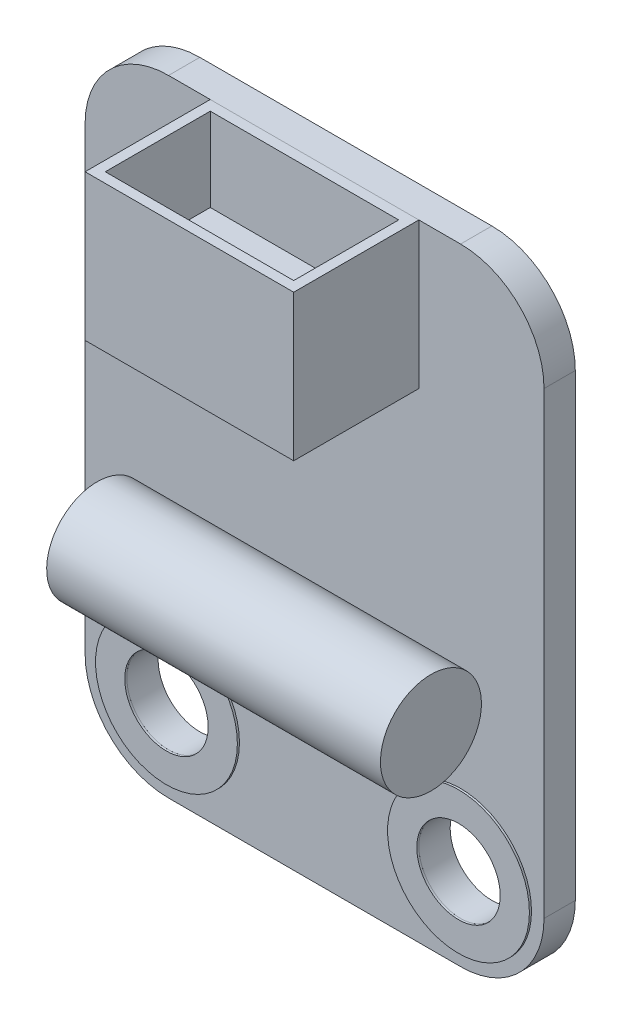
ISO-10303-21;
HEADER;
FILE_DESCRIPTION(('STEP AP214'),'2;1');
FILE_NAME('part.step','',(''),(''),'','','');
FILE_SCHEMA(('AUTOMOTIVE_DESIGN { 1 0 10303 214 1 1 1 1 }'));
ENDSEC;
DATA;
#1=APPLICATION_CONTEXT('core data for automotive mechanical design processes');
#2=APPLICATION_PROTOCOL_DEFINITION('international standard','automotive_design',2000,#1);
#3=PRODUCT_CONTEXT('',#1,'mechanical');
#4=PRODUCT('Part','Part','',(#3));
#5=PRODUCT_RELATED_PRODUCT_CATEGORY('part','',(#4));
#6=PRODUCT_DEFINITION_FORMATION('','',#4);
#7=PRODUCT_DEFINITION_CONTEXT('part definition',#1,'design');
#8=PRODUCT_DEFINITION('design','',#6,#7);
#9=PRODUCT_DEFINITION_SHAPE('','',#8);
#10=(LENGTH_UNIT() NAMED_UNIT(*) SI_UNIT(.MILLI.,.METRE.));
#11=(NAMED_UNIT(*) PLANE_ANGLE_UNIT() SI_UNIT($,.RADIAN.));
#12=(NAMED_UNIT(*) SI_UNIT($,.STERADIAN.) SOLID_ANGLE_UNIT());
#13=UNCERTAINTY_MEASURE_WITH_UNIT(LENGTH_MEASURE(1.E-05),#10,'distance_accuracy_value','');
#14=(GEOMETRIC_REPRESENTATION_CONTEXT(3) GLOBAL_UNCERTAINTY_ASSIGNED_CONTEXT((#13)) GLOBAL_UNIT_ASSIGNED_CONTEXT((#10,
#11,#12)) REPRESENTATION_CONTEXT('',''));
#15=CARTESIAN_POINT('',(0.,0.,0.));
#16=DIRECTION('',(0.,0.,1.));
#17=DIRECTION('',(1.,0.,0.));
#18=AXIS2_PLACEMENT_3D('',#15,#16,#17);
#19=CARTESIAN_POINT('',(0.,0.,0.));
#20=DIRECTION('',(0.,0.,1.));
#21=DIRECTION('',(1.,0.,0.));
#22=AXIS2_PLACEMENT_3D('',#19,#20,#21);
#23=PLANE('',#22);
#24=CARTESIAN_POINT('',(7.,-11.,0.));
#25=DIRECTION('',(0.,0.,-1.));
#26=DIRECTION('',(1.,0.,0.));
#27=AXIS2_PLACEMENT_3D('',#24,#25,#26);
#28=CIRCLE('',#27,2.);
#29=CARTESIAN_POINT('',(5.,-11.,0.));
#30=VERTEX_POINT('',#29);
#31=EDGE_CURVE('P0_E162',#30,#30,#28,.T.);
#32=ORIENTED_EDGE('',*,*,#31,.F.);
#33=EDGE_LOOP('',(#32));
#34=FACE_BOUND('',#33,.T.);
#35=CARTESIAN_POINT('',(-7.,-11.,0.));
#36=DIRECTION('',(0.,0.,-1.));
#37=DIRECTION('',(1.,0.,0.));
#38=AXIS2_PLACEMENT_3D('',#35,#36,#37);
#39=CIRCLE('',#38,2.);
#40=CARTESIAN_POINT('',(-9.,-11.,0.));
#41=VERTEX_POINT('',#40);
#42=EDGE_CURVE('P0_E174',#41,#41,#39,.T.);
#43=ORIENTED_EDGE('',*,*,#42,.F.);
#44=EDGE_LOOP('',(#43));
#45=FACE_BOUND('',#44,.T.);
#46=CARTESIAN_POINT('',(7.,-11.,0.));
#47=DIRECTION('',(0.,0.,1.));
#48=DIRECTION('',(0.,-1.,0.));
#49=AXIS2_PLACEMENT_3D('',#46,#47,#48);
#50=CIRCLE('',#49,4.);
#51=CARTESIAN_POINT('',(7.,-15.,0.));
#52=VERTEX_POINT('',#51);
#53=CARTESIAN_POINT('',(11.,-11.,0.));
#54=VERTEX_POINT('',#53);
#55=EDGE_CURVE('P0_E20',#52,#54,#50,.T.);
#56=ORIENTED_EDGE('',*,*,#55,.F.);
#57=DIRECTION('',(1.,0.,0.));
#58=VECTOR('',#57,1.);
#59=CARTESIAN_POINT('',(-7.,-15.,0.));
#60=LINE('',#59,#58);
#61=CARTESIAN_POINT('',(-7.,-15.,0.));
#62=VERTEX_POINT('',#61);
#63=EDGE_CURVE('P0_E143',#62,#52,#60,.T.);
#64=ORIENTED_EDGE('',*,*,#63,.F.);
#65=CARTESIAN_POINT('',(-7.,-11.,0.));
#66=DIRECTION('',(0.,0.,1.));
#67=DIRECTION('',(-1.,0.,0.));
#68=AXIS2_PLACEMENT_3D('',#65,#66,#67);
#69=CIRCLE('',#68,4.);
#70=CARTESIAN_POINT('',(-11.,-11.,0.));
#71=VERTEX_POINT('',#70);
#72=EDGE_CURVE('P0_E136',#71,#62,#69,.T.);
#73=ORIENTED_EDGE('',*,*,#72,.F.);
#74=DIRECTION('',(0.,-1.,0.));
#75=VECTOR('',#74,1.);
#76=CARTESIAN_POINT('',(-11.,11.,0.));
#77=LINE('',#76,#75);
#78=CARTESIAN_POINT('',(-11.,11.,0.));
#79=VERTEX_POINT('',#78);
#80=EDGE_CURVE('P0_E119',#79,#71,#77,.T.);
#81=ORIENTED_EDGE('',*,*,#80,.F.);
#82=CARTESIAN_POINT('',(-7.,11.,0.));
#83=DIRECTION('',(0.,0.,1.));
#84=DIRECTION('',(0.,1.,0.));
#85=AXIS2_PLACEMENT_3D('',#82,#83,#84);
#86=CIRCLE('',#85,4.);
#87=CARTESIAN_POINT('',(-7.,15.,0.));
#88=VERTEX_POINT('',#87);
#89=EDGE_CURVE('P0_E181',#88,#79,#86,.T.);
#90=ORIENTED_EDGE('',*,*,#89,.F.);
#91=DIRECTION('',(-1.,0.,0.));
#92=VECTOR('',#91,1.);
#93=CARTESIAN_POINT('',(7.,15.,0.));
#94=LINE('',#93,#92);
#95=CARTESIAN_POINT('',(7.,15.,0.));
#96=VERTEX_POINT('',#95);
#97=EDGE_CURVE('P0_E194',#96,#88,#94,.T.);
#98=ORIENTED_EDGE('',*,*,#97,.F.);
#99=CARTESIAN_POINT('',(7.,11.,0.));
#100=DIRECTION('',(0.,0.,1.));
#101=DIRECTION('',(1.,0.,0.));
#102=AXIS2_PLACEMENT_3D('',#99,#100,#101);
#103=CIRCLE('',#102,4.);
#104=CARTESIAN_POINT('',(11.,11.,0.));
#105=VERTEX_POINT('',#104);
#106=EDGE_CURVE('P0_E204',#105,#96,#103,.T.);
#107=ORIENTED_EDGE('',*,*,#106,.F.);
#108=DIRECTION('',(0.,1.,0.));
#109=VECTOR('',#108,1.);
#110=CARTESIAN_POINT('',(11.,-11.,0.));
#111=LINE('',#110,#109);
#112=EDGE_CURVE('P0_E214',#54,#105,#111,.T.);
#113=ORIENTED_EDGE('',*,*,#112,.F.);
#114=EDGE_LOOP('',(#56,#64,#73,#81,#90,#98,#107,#113));
#115=FACE_BOUND('',#114,.T.);
#116=ADVANCED_FACE('P0_F17',(#34,#45,#115),#23,.F.);
#117=CARTESIAN_POINT('',(0.,0.,1.5));
#118=DIRECTION('',(0.,0.,1.));
#119=DIRECTION('',(1.,0.,0.));
#120=AXIS2_PLACEMENT_3D('',#117,#118,#119);
#121=PLANE('',#120);
#122=CARTESIAN_POINT('',(7.,-11.,1.5));
#123=DIRECTION('',(0.,0.,-1.));
#124=DIRECTION('',(1.,0.,0.));
#125=AXIS2_PLACEMENT_3D('',#122,#123,#124);
#126=CIRCLE('',#125,2.);
#127=CARTESIAN_POINT('',(5.,-11.,1.5));
#128=VERTEX_POINT('',#127);
#129=EDGE_CURVE('P0_E157',#128,#128,#126,.T.);
#130=ORIENTED_EDGE('',*,*,#129,.T.);
#131=EDGE_LOOP('',(#130));
#132=FACE_BOUND('',#131,.T.);
#133=CARTESIAN_POINT('',(-7.,-11.,1.5));
#134=DIRECTION('',(0.,0.,-1.));
#135=DIRECTION('',(1.,0.,0.));
#136=AXIS2_PLACEMENT_3D('',#133,#134,#135);
#137=CIRCLE('',#136,2.);
#138=CARTESIAN_POINT('',(-9.,-11.,1.5));
#139=VERTEX_POINT('',#138);
#140=EDGE_CURVE('P0_E166',#139,#139,#137,.T.);
#141=ORIENTED_EDGE('',*,*,#140,.T.);
#142=EDGE_LOOP('',(#141));
#143=FACE_BOUND('',#142,.T.);
#144=CARTESIAN_POINT('',(7.,-11.,1.5));
#145=DIRECTION('',(0.,0.,1.));
#146=DIRECTION('',(0.,-1.,0.));
#147=AXIS2_PLACEMENT_3D('',#144,#145,#146);
#148=CIRCLE('',#147,4.);
#149=CARTESIAN_POINT('',(7.,-15.,1.5));
#150=VERTEX_POINT('',#149);
#151=CARTESIAN_POINT('',(11.,-11.,1.5));
#152=VERTEX_POINT('',#151);
#153=EDGE_CURVE('P0_E11',#150,#152,#148,.T.);
#154=ORIENTED_EDGE('',*,*,#153,.T.);
#155=DIRECTION('',(0.,1.,0.));
#156=VECTOR('',#155,1.);
#157=CARTESIAN_POINT('',(11.,-11.,1.5));
#158=LINE('',#157,#156);
#159=CARTESIAN_POINT('',(11.,11.,1.5));
#160=VERTEX_POINT('',#159);
#161=EDGE_CURVE('P0_E217',#152,#160,#158,.T.);
#162=ORIENTED_EDGE('',*,*,#161,.T.);
#163=CARTESIAN_POINT('',(7.,11.,1.5));
#164=DIRECTION('',(0.,0.,1.));
#165=DIRECTION('',(1.,0.,0.));
#166=AXIS2_PLACEMENT_3D('',#163,#164,#165);
#167=CIRCLE('',#166,4.);
#168=CARTESIAN_POINT('',(7.,15.,1.5));
#169=VERTEX_POINT('',#168);
#170=EDGE_CURVE('P0_E207',#160,#169,#167,.T.);
#171=ORIENTED_EDGE('',*,*,#170,.T.);
#172=DIRECTION('',(-1.,0.,0.));
#173=VECTOR('',#172,1.);
#174=CARTESIAN_POINT('',(7.,15.,1.5));
#175=LINE('',#174,#173);
#176=CARTESIAN_POINT('',(-7.,15.,1.5));
#177=VERTEX_POINT('',#176);
#178=EDGE_CURVE('P0_E197',#169,#177,#175,.T.);
#179=ORIENTED_EDGE('',*,*,#178,.T.);
#180=CARTESIAN_POINT('',(-7.,11.,1.5));
#181=DIRECTION('',(0.,0.,1.));
#182=DIRECTION('',(0.,1.,0.));
#183=AXIS2_PLACEMENT_3D('',#180,#181,#182);
#184=CIRCLE('',#183,4.);
#185=CARTESIAN_POINT('',(-11.,11.,1.5));
#186=VERTEX_POINT('',#185);
#187=EDGE_CURVE('P0_E187',#177,#186,#184,.T.);
#188=ORIENTED_EDGE('',*,*,#187,.T.);
#189=DIRECTION('',(0.,-1.,0.));
#190=VECTOR('',#189,1.);
#191=CARTESIAN_POINT('',(-11.,11.,1.5));
#192=LINE('',#191,#190);
#193=CARTESIAN_POINT('',(-11.,-11.,1.5));
#194=VERTEX_POINT('',#193);
#195=EDGE_CURVE('P0_E131',#186,#194,#192,.T.);
#196=ORIENTED_EDGE('',*,*,#195,.T.);
#197=CARTESIAN_POINT('',(-7.,-11.,1.5));
#198=DIRECTION('',(0.,0.,1.));
#199=DIRECTION('',(-1.,0.,0.));
#200=AXIS2_PLACEMENT_3D('',#197,#198,#199);
#201=CIRCLE('',#200,4.);
#202=CARTESIAN_POINT('',(-7.,-15.,1.5));
#203=VERTEX_POINT('',#202);
#204=EDGE_CURVE('P0_E138',#194,#203,#201,.T.);
#205=ORIENTED_EDGE('',*,*,#204,.T.);
#206=DIRECTION('',(1.,0.,0.));
#207=VECTOR('',#206,1.);
#208=CARTESIAN_POINT('',(-7.,-15.,1.5));
#209=LINE('',#208,#207);
#210=EDGE_CURVE('P0_E153',#203,#150,#209,.T.);
#211=ORIENTED_EDGE('',*,*,#210,.T.);
#212=EDGE_LOOP('',(#154,#162,#171,#179,#188,#196,#205,#211));
#213=FACE_BOUND('',#212,.T.);
#214=ADVANCED_FACE('P0_F239',(#132,#143,#213),#121,.T.);
#215=CARTESIAN_POINT('',(7.,-11.,0.));
#216=DIRECTION('',(0.,0.,1.));
#217=DIRECTION('',(0.,-1.,0.));
#218=AXIS2_PLACEMENT_3D('',#215,#216,#217);
#219=CYLINDRICAL_SURFACE('',#218,4.);
#220=ORIENTED_EDGE('',*,*,#55,.T.);
#221=DIRECTION('',(0.,0.,1.));
#222=VECTOR('',#221,1.);
#223=CARTESIAN_POINT('',(11.,-11.,0.));
#224=LINE('',#223,#222);
#225=EDGE_CURVE('P0_E219',#54,#152,#224,.T.);
#226=ORIENTED_EDGE('',*,*,#225,.T.);
#227=ORIENTED_EDGE('',*,*,#153,.F.);
#228=DIRECTION('',(0.,0.,1.));
#229=VECTOR('',#228,1.);
#230=CARTESIAN_POINT('',(7.,-15.,0.));
#231=LINE('',#230,#229);
#232=EDGE_CURVE('P0_E178',#52,#150,#231,.T.);
#233=ORIENTED_EDGE('',*,*,#232,.F.);
#234=EDGE_LOOP('',(#220,#226,#227,#233));
#235=FACE_BOUND('',#234,.T.);
#236=ADVANCED_FACE('P0_F257',(#235),#219,.T.);
#237=CARTESIAN_POINT('',(11.,-11.,0.));
#238=DIRECTION('',(1.,0.,0.));
#239=DIRECTION('',(0.,1.,0.));
#240=AXIS2_PLACEMENT_3D('',#237,#238,#239);
#241=PLANE('',#240);
#242=ORIENTED_EDGE('',*,*,#112,.T.);
#243=DIRECTION('',(0.,0.,1.));
#244=VECTOR('',#243,1.);
#245=CARTESIAN_POINT('',(11.,11.,0.));
#246=LINE('',#245,#244);
#247=EDGE_CURVE('P0_E210',#105,#160,#246,.T.);
#248=ORIENTED_EDGE('',*,*,#247,.T.);
#249=ORIENTED_EDGE('',*,*,#161,.F.);
#250=ORIENTED_EDGE('',*,*,#225,.F.);
#251=EDGE_LOOP('',(#242,#248,#249,#250));
#252=FACE_BOUND('',#251,.T.);
#253=ADVANCED_FACE('P0_F249',(#252),#241,.T.);
#254=CARTESIAN_POINT('',(7.,11.,0.));
#255=DIRECTION('',(0.,0.,1.));
#256=DIRECTION('',(1.,0.,0.));
#257=AXIS2_PLACEMENT_3D('',#254,#255,#256);
#258=CYLINDRICAL_SURFACE('',#257,4.);
#259=ORIENTED_EDGE('',*,*,#106,.T.);
#260=DIRECTION('',(0.,0.,1.));
#261=VECTOR('',#260,1.);
#262=CARTESIAN_POINT('',(7.,15.,0.));
#263=LINE('',#262,#261);
#264=EDGE_CURVE('P0_E200',#96,#169,#263,.T.);
#265=ORIENTED_EDGE('',*,*,#264,.T.);
#266=ORIENTED_EDGE('',*,*,#170,.F.);
#267=ORIENTED_EDGE('',*,*,#247,.F.);
#268=EDGE_LOOP('',(#259,#265,#266,#267));
#269=FACE_BOUND('',#268,.T.);
#270=ADVANCED_FACE('P0_F244',(#269),#258,.T.);
#271=CARTESIAN_POINT('',(7.,15.,0.));
#272=DIRECTION('',(0.,1.,0.));
#273=DIRECTION('',(1.,0.,0.));
#274=AXIS2_PLACEMENT_3D('',#271,#272,#273);
#275=PLANE('',#274);
#276=ORIENTED_EDGE('',*,*,#97,.T.);
#277=DIRECTION('',(0.,0.,1.));
#278=VECTOR('',#277,1.);
#279=CARTESIAN_POINT('',(-7.,15.,0.));
#280=LINE('',#279,#278);
#281=EDGE_CURVE('P0_E190',#88,#177,#280,.T.);
#282=ORIENTED_EDGE('',*,*,#281,.T.);
#283=ORIENTED_EDGE('',*,*,#178,.F.);
#284=ORIENTED_EDGE('',*,*,#264,.F.);
#285=EDGE_LOOP('',(#276,#282,#283,#284));
#286=FACE_BOUND('',#285,.T.);
#287=ADVANCED_FACE('P0_F248',(#286),#275,.T.);
#288=CARTESIAN_POINT('',(-7.,11.,0.));
#289=DIRECTION('',(0.,0.,1.));
#290=DIRECTION('',(0.,1.,0.));
#291=AXIS2_PLACEMENT_3D('',#288,#289,#290);
#292=CYLINDRICAL_SURFACE('',#291,4.);
#293=ORIENTED_EDGE('',*,*,#89,.T.);
#294=DIRECTION('',(0.,0.,1.));
#295=VECTOR('',#294,1.);
#296=CARTESIAN_POINT('',(-11.,11.,0.));
#297=LINE('',#296,#295);
#298=EDGE_CURVE('P0_E126',#79,#186,#297,.T.);
#299=ORIENTED_EDGE('',*,*,#298,.T.);
#300=ORIENTED_EDGE('',*,*,#187,.F.);
#301=ORIENTED_EDGE('',*,*,#281,.F.);
#302=EDGE_LOOP('',(#293,#299,#300,#301));
#303=FACE_BOUND('',#302,.T.);
#304=ADVANCED_FACE('P0_F266',(#303),#292,.T.);
#305=CARTESIAN_POINT('',(-11.,11.,0.));
#306=DIRECTION('',(-1.,0.,0.));
#307=DIRECTION('',(0.,0.,1.));
#308=AXIS2_PLACEMENT_3D('',#305,#306,#307);
#309=PLANE('',#308);
#310=ORIENTED_EDGE('',*,*,#80,.T.);
#311=DIRECTION('',(0.,0.,1.));
#312=VECTOR('',#311,1.);
#313=CARTESIAN_POINT('',(-11.,-11.,0.));
#314=LINE('',#313,#312);
#315=EDGE_CURVE('P0_E123',#71,#194,#314,.T.);
#316=ORIENTED_EDGE('',*,*,#315,.T.);
#317=ORIENTED_EDGE('',*,*,#195,.F.);
#318=ORIENTED_EDGE('',*,*,#298,.F.);
#319=EDGE_LOOP('',(#310,#316,#317,#318));
#320=FACE_BOUND('',#319,.T.);
#321=ADVANCED_FACE('P0_F121',(#320),#309,.T.);
#322=CARTESIAN_POINT('',(-7.,-11.,0.));
#323=DIRECTION('',(0.,0.,1.));
#324=DIRECTION('',(-1.,0.,0.));
#325=AXIS2_PLACEMENT_3D('',#322,#323,#324);
#326=CYLINDRICAL_SURFACE('',#325,4.);
#327=ORIENTED_EDGE('',*,*,#72,.T.);
#328=DIRECTION('',(0.,0.,1.));
#329=VECTOR('',#328,1.);
#330=CARTESIAN_POINT('',(-7.,-15.,0.));
#331=LINE('',#330,#329);
#332=EDGE_CURVE('P0_E145',#62,#203,#331,.T.);
#333=ORIENTED_EDGE('',*,*,#332,.T.);
#334=ORIENTED_EDGE('',*,*,#204,.F.);
#335=ORIENTED_EDGE('',*,*,#315,.F.);
#336=EDGE_LOOP('',(#327,#333,#334,#335));
#337=FACE_BOUND('',#336,.T.);
#338=ADVANCED_FACE('P0_F134',(#337),#326,.T.);
#339=CARTESIAN_POINT('',(-7.,-15.,0.));
#340=DIRECTION('',(0.,-1.,0.));
#341=DIRECTION('',(0.,0.,-1.));
#342=AXIS2_PLACEMENT_3D('',#339,#340,#341);
#343=PLANE('',#342);
#344=ORIENTED_EDGE('',*,*,#63,.T.);
#345=ORIENTED_EDGE('',*,*,#232,.T.);
#346=ORIENTED_EDGE('',*,*,#210,.F.);
#347=ORIENTED_EDGE('',*,*,#332,.F.);
#348=EDGE_LOOP('',(#344,#345,#346,#347));
#349=FACE_BOUND('',#348,.T.);
#350=ADVANCED_FACE('P0_F297',(#349),#343,.T.);
#351=CARTESIAN_POINT('',(-7.,-11.,0.));
#352=DIRECTION('',(0.,0.,1.));
#353=DIRECTION('',(1.,0.,0.));
#354=AXIS2_PLACEMENT_3D('',#351,#352,#353);
#355=CYLINDRICAL_SURFACE('',#354,2.);
#356=ORIENTED_EDGE('',*,*,#140,.F.);
#357=DIRECTION('',(0.,0.,-1.));
#358=VECTOR('',#357,1.);
#359=CARTESIAN_POINT('',(-9.,-11.,0.));
#360=LINE('',#359,#358);
#361=EDGE_CURVE('P0_E170',#139,#41,#360,.T.);
#362=ORIENTED_EDGE('',*,*,#361,.T.);
#363=ORIENTED_EDGE('',*,*,#42,.T.);
#364=ORIENTED_EDGE('',*,*,#361,.F.);
#365=EDGE_LOOP('',(#356,#362,#363,#364));
#366=FACE_BOUND('',#365,.T.);
#367=ADVANCED_FACE('P0_F305',(#366),#355,.F.);
#368=CARTESIAN_POINT('',(7.,-11.,0.));
#369=DIRECTION('',(0.,0.,1.));
#370=DIRECTION('',(1.,0.,0.));
#371=AXIS2_PLACEMENT_3D('',#368,#369,#370);
#372=CYLINDRICAL_SURFACE('',#371,2.);
#373=ORIENTED_EDGE('',*,*,#129,.F.);
#374=DIRECTION('',(0.,0.,-1.));
#375=VECTOR('',#374,1.);
#376=CARTESIAN_POINT('',(5.,-11.,0.));
#377=LINE('',#376,#375);
#378=EDGE_CURVE('P0_E159',#128,#30,#377,.T.);
#379=ORIENTED_EDGE('',*,*,#378,.T.);
#380=ORIENTED_EDGE('',*,*,#31,.T.);
#381=ORIENTED_EDGE('',*,*,#378,.F.);
#382=EDGE_LOOP('',(#373,#379,#380,#381));
#383=FACE_BOUND('',#382,.T.);
#384=ADVANCED_FACE('P0_F314',(#383),#372,.F.);
#385=CLOSED_SHELL('',(#116,#214,#236,#253,#270,#287,#304,#321,#338,#350,#367,#384));
#386=MANIFOLD_SOLID_BREP('P0_B1',#385);
#387=CARTESIAN_POINT('',(8.,-3.57882239901738,3.92101345827787));
#388=DIRECTION('',(1.,0.,0.));
#389=DIRECTION('',(0.,1.,0.));
#390=AXIS2_PLACEMENT_3D('',#387,#388,#389);
#391=PLANE('',#390);
#392=CARTESIAN_POINT('',(8.,-3.57882239901738,3.92101345827787));
#393=DIRECTION('',(1.,0.,0.));
#394=DIRECTION('',(0.,1.,0.));
#395=AXIS2_PLACEMENT_3D('',#392,#393,#394);
#396=CIRCLE('',#395,2.42101345827787);
#397=CARTESIAN_POINT('',(8.,-5.99983585729524,3.92101345827787));
#398=VERTEX_POINT('',#397);
#399=EDGE_CURVE('P1_E25',#398,#398,#396,.T.);
#400=ORIENTED_EDGE('',*,*,#399,.T.);
#401=EDGE_LOOP('',(#400));
#402=FACE_BOUND('',#401,.T.);
#403=ADVANCED_FACE('P1_F17',(#402),#391,.T.);
#404=CARTESIAN_POINT('',(0.,-3.57882239901738,3.92101345827787));
#405=DIRECTION('',(1.,0.,0.));
#406=DIRECTION('',(0.,1.,0.));
#407=AXIS2_PLACEMENT_3D('',#404,#405,#406);
#408=CYLINDRICAL_SURFACE('',#407,2.42101345827787);
#409=ORIENTED_EDGE('',*,*,#399,.F.);
#410=DIRECTION('',(-1.,0.,0.));
#411=VECTOR('',#410,1.);
#412=CARTESIAN_POINT('',(0.,-5.99983585729524,3.92101345827787));
#413=LINE('',#412,#411);
#414=CARTESIAN_POINT('',(-8.,-5.99983585729524,3.92101345827787));
#415=VERTEX_POINT('',#414);
#416=EDGE_CURVE('P1_E11',#398,#415,#413,.T.);
#417=ORIENTED_EDGE('',*,*,#416,.T.);
#418=CARTESIAN_POINT('',(-8.,-3.57882239901738,3.92101345827787));
#419=DIRECTION('',(-1.,0.,0.));
#420=DIRECTION('',(0.,1.,0.));
#421=AXIS2_PLACEMENT_3D('',#418,#419,#420);
#422=CIRCLE('',#421,2.42101345827787);
#423=EDGE_CURVE('P1_E41',#415,#415,#422,.T.);
#424=ORIENTED_EDGE('',*,*,#423,.F.);
#425=ORIENTED_EDGE('',*,*,#416,.F.);
#426=EDGE_LOOP('',(#409,#417,#424,#425));
#427=FACE_BOUND('',#426,.T.);
#428=ADVANCED_FACE('P1_F40',(#427),#408,.T.);
#429=CARTESIAN_POINT('',(-8.,-3.57882239901738,3.92101345827787));
#430=DIRECTION('',(1.,0.,0.));
#431=DIRECTION('',(0.,1.,0.));
#432=AXIS2_PLACEMENT_3D('',#429,#430,#431);
#433=PLANE('',#432);
#434=ORIENTED_EDGE('',*,*,#423,.T.);
#435=EDGE_LOOP('',(#434));
#436=FACE_BOUND('',#435,.T.);
#437=ADVANCED_FACE('P1_F43',(#436),#433,.F.);
#438=CLOSED_SHELL('',(#403,#428,#437));
#439=MANIFOLD_SOLID_BREP('P1_B1',#438);
#440=CARTESIAN_POINT('',(6.01740879346835E-13,8.,4.5));
#441=DIRECTION('',(0.,-1.,0.));
#442=DIRECTION('',(0.,0.,-1.));
#443=AXIS2_PLACEMENT_3D('',#440,#441,#442);
#444=PLANE('',#443);
#445=DIRECTION('',(2.00580293115612E-13,0.,1.));
#446=VECTOR('',#445,1.);
#447=CARTESIAN_POINT('',(5.0000000000006,8.,7.5));
#448=LINE('',#447,#446);
#449=CARTESIAN_POINT('',(4.9999999999994,8.,1.5));
#450=VERTEX_POINT('',#449);
#451=CARTESIAN_POINT('',(5.0000000000006,8.,7.5));
#452=VERTEX_POINT('',#451);
#453=EDGE_CURVE('P2_E11',#450,#452,#448,.T.);
#454=ORIENTED_EDGE('',*,*,#453,.T.);
#455=DIRECTION('',(-1.,0.,0.));
#456=VECTOR('',#455,1.);
#457=CARTESIAN_POINT('',(-4.9999999999994,8.,7.5));
#458=LINE('',#457,#456);
#459=CARTESIAN_POINT('',(-4.9999999999994,8.,7.5));
#460=VERTEX_POINT('',#459);
#461=EDGE_CURVE('P2_E197',#452,#460,#458,.T.);
#462=ORIENTED_EDGE('',*,*,#461,.T.);
#463=DIRECTION('',(0.,0.,-1.));
#464=VECTOR('',#463,1.);
#465=CARTESIAN_POINT('',(-4.9999999999994,8.,1.5));
#466=LINE('',#465,#464);
#467=CARTESIAN_POINT('',(-4.9999999999994,8.,1.5));
#468=VERTEX_POINT('',#467);
#469=EDGE_CURVE('P2_E185',#460,#468,#466,.T.);
#470=ORIENTED_EDGE('',*,*,#469,.T.);
#471=DIRECTION('',(1.,0.,0.));
#472=VECTOR('',#471,1.);
#473=CARTESIAN_POINT('',(4.9999999999994,8.,1.5));
#474=LINE('',#473,#472);
#475=EDGE_CURVE('P2_E168',#468,#450,#474,.T.);
#476=ORIENTED_EDGE('',*,*,#475,.T.);
#477=EDGE_LOOP('',(#454,#462,#470,#476));
#478=FACE_BOUND('',#477,.T.);
#479=ADVANCED_FACE('P2_F17',(#478),#444,.T.);
#480=CARTESIAN_POINT('',(6.01740879346835E-13,15.,4.5));
#481=DIRECTION('',(0.,1.,0.));
#482=DIRECTION('',(1.,0.,0.));
#483=AXIS2_PLACEMENT_3D('',#480,#481,#482);
#484=PLANE('',#483);
#485=DIRECTION('',(1.,0.,0.));
#486=VECTOR('',#485,1.);
#487=CARTESIAN_POINT('',(-2.25826461349151,15.,1.98347077301577));
#488=LINE('',#487,#486);
#489=CARTESIAN_POINT('',(-4.51652922698363,15.,1.98347077301577));
#490=VERTEX_POINT('',#489);
#491=CARTESIAN_POINT('',(4.51652922698483,15.,1.98347077301577));
#492=VERTEX_POINT('',#491);
#493=EDGE_CURVE('P2_E143',#490,#492,#488,.T.);
#494=ORIENTED_EDGE('',*,*,#493,.T.);
#495=DIRECTION('',(0.,0.,1.));
#496=VECTOR('',#495,1.);
#497=CARTESIAN_POINT('',(4.51652922698483,15.,3.24173538650788));
#498=LINE('',#497,#496);
#499=CARTESIAN_POINT('',(4.51652922698483,15.,7.01652922698423));
#500=VERTEX_POINT('',#499);
#501=EDGE_CURVE('P2_E111',#492,#500,#498,.T.);
#502=ORIENTED_EDGE('',*,*,#501,.T.);
#503=DIRECTION('',(-1.,0.,0.));
#504=VECTOR('',#503,1.);
#505=CARTESIAN_POINT('',(2.25826461349272,15.,7.01652922698423));
#506=LINE('',#505,#504);
#507=CARTESIAN_POINT('',(-4.51652922698363,15.,7.01652922698423));
#508=VERTEX_POINT('',#507);
#509=EDGE_CURVE('P2_E131',#500,#508,#506,.T.);
#510=ORIENTED_EDGE('',*,*,#509,.T.);
#511=DIRECTION('',(0.,0.,-1.));
#512=VECTOR('',#511,1.);
#513=CARTESIAN_POINT('',(-4.51652922698363,15.,5.75826461349212));
#514=LINE('',#513,#512);
#515=EDGE_CURVE('P2_E152',#508,#490,#514,.T.);
#516=ORIENTED_EDGE('',*,*,#515,.T.);
#517=EDGE_LOOP('',(#494,#502,#510,#516));
#518=FACE_BOUND('',#517,.T.);
#519=DIRECTION('',(-2.00580293115612E-13,0.,-1.));
#520=VECTOR('',#519,1.);
#521=CARTESIAN_POINT('',(5.0000000000006,15.,7.5));
#522=LINE('',#521,#520);
#523=CARTESIAN_POINT('',(5.0000000000006,15.,7.5));
#524=VERTEX_POINT('',#523);
#525=CARTESIAN_POINT('',(4.9999999999994,15.,1.5));
#526=VERTEX_POINT('',#525);
#527=EDGE_CURVE('P2_E25',#524,#526,#522,.T.);
#528=ORIENTED_EDGE('',*,*,#527,.T.);
#529=DIRECTION('',(-1.,0.,0.));
#530=VECTOR('',#529,1.);
#531=CARTESIAN_POINT('',(4.9999999999994,15.,1.5));
#532=LINE('',#531,#530);
#533=CARTESIAN_POINT('',(-4.9999999999994,15.,1.5));
#534=VERTEX_POINT('',#533);
#535=EDGE_CURVE('P2_E179',#526,#534,#532,.T.);
#536=ORIENTED_EDGE('',*,*,#535,.T.);
#537=DIRECTION('',(0.,0.,1.));
#538=VECTOR('',#537,1.);
#539=CARTESIAN_POINT('',(-4.9999999999994,15.,1.5));
#540=LINE('',#539,#538);
#541=CARTESIAN_POINT('',(-4.9999999999994,15.,7.5));
#542=VERTEX_POINT('',#541);
#543=EDGE_CURVE('P2_E85',#534,#542,#540,.T.);
#544=ORIENTED_EDGE('',*,*,#543,.T.);
#545=DIRECTION('',(1.,0.,0.));
#546=VECTOR('',#545,1.);
#547=CARTESIAN_POINT('',(-4.9999999999994,15.,7.5));
#548=LINE('',#547,#546);
#549=EDGE_CURVE('P2_E184',#542,#524,#548,.T.);
#550=ORIENTED_EDGE('',*,*,#549,.T.);
#551=EDGE_LOOP('',(#528,#536,#544,#550));
#552=FACE_BOUND('',#551,.T.);
#553=ADVANCED_FACE('P2_F281',(#518,#552),#484,.T.);
#554=CARTESIAN_POINT('',(4.9999999999994,15.,1.5));
#555=DIRECTION('',(1.,0.,-2.00580293115612E-13));
#556=DIRECTION('',(-2.00580293115612E-13,0.,-1.));
#557=AXIS2_PLACEMENT_3D('',#554,#555,#556);
#558=PLANE('',#557);
#559=ORIENTED_EDGE('',*,*,#527,.F.);
#560=DIRECTION('',(0.,-1.,0.));
#561=VECTOR('',#560,1.);
#562=CARTESIAN_POINT('',(5.0000000000006,15.,7.5));
#563=LINE('',#562,#561);
#564=EDGE_CURVE('P2_E200',#524,#452,#563,.T.);
#565=ORIENTED_EDGE('',*,*,#564,.T.);
#566=ORIENTED_EDGE('',*,*,#453,.F.);
#567=DIRECTION('',(0.,-1.,0.));
#568=VECTOR('',#567,1.);
#569=CARTESIAN_POINT('',(4.9999999999994,15.,1.5));
#570=LINE('',#569,#568);
#571=EDGE_CURVE('P2_E172',#526,#450,#570,.T.);
#572=ORIENTED_EDGE('',*,*,#571,.F.);
#573=EDGE_LOOP('',(#559,#565,#566,#572));
#574=FACE_BOUND('',#573,.T.);
#575=ADVANCED_FACE('P2_F288',(#574),#558,.T.);
#576=CARTESIAN_POINT('',(5.0000000000006,15.,7.5));
#577=DIRECTION('',(0.,0.,1.));
#578=DIRECTION('',(1.,0.,0.));
#579=AXIS2_PLACEMENT_3D('',#576,#577,#578);
#580=PLANE('',#579);
#581=ORIENTED_EDGE('',*,*,#549,.F.);
#582=DIRECTION('',(0.,-1.,0.));
#583=VECTOR('',#582,1.);
#584=CARTESIAN_POINT('',(-4.9999999999994,15.,7.5));
#585=LINE('',#584,#583);
#586=EDGE_CURVE('P2_E180',#542,#460,#585,.T.);
#587=ORIENTED_EDGE('',*,*,#586,.T.);
#588=ORIENTED_EDGE('',*,*,#461,.F.);
#589=ORIENTED_EDGE('',*,*,#564,.F.);
#590=EDGE_LOOP('',(#581,#587,#588,#589));
#591=FACE_BOUND('',#590,.T.);
#592=ADVANCED_FACE('P2_F296',(#591),#580,.T.);
#593=CARTESIAN_POINT('',(-4.9999999999994,15.,7.5));
#594=DIRECTION('',(-1.,0.,0.));
#595=DIRECTION('',(0.,0.,1.));
#596=AXIS2_PLACEMENT_3D('',#593,#594,#595);
#597=PLANE('',#596);
#598=ORIENTED_EDGE('',*,*,#543,.F.);
#599=DIRECTION('',(0.,-1.,0.));
#600=VECTOR('',#599,1.);
#601=CARTESIAN_POINT('',(-4.9999999999994,15.,1.5));
#602=LINE('',#601,#600);
#603=EDGE_CURVE('P2_E171',#534,#468,#602,.T.);
#604=ORIENTED_EDGE('',*,*,#603,.T.);
#605=ORIENTED_EDGE('',*,*,#469,.F.);
#606=ORIENTED_EDGE('',*,*,#586,.F.);
#607=EDGE_LOOP('',(#598,#604,#605,#606));
#608=FACE_BOUND('',#607,.T.);
#609=ADVANCED_FACE('P2_F301',(#608),#597,.T.);
#610=CARTESIAN_POINT('',(-4.9999999999994,15.,1.5));
#611=DIRECTION('',(0.,0.,-1.));
#612=DIRECTION('',(0.,-1.,0.));
#613=AXIS2_PLACEMENT_3D('',#610,#611,#612);
#614=PLANE('',#613);
#615=ORIENTED_EDGE('',*,*,#535,.F.);
#616=ORIENTED_EDGE('',*,*,#571,.T.);
#617=ORIENTED_EDGE('',*,*,#475,.F.);
#618=ORIENTED_EDGE('',*,*,#603,.F.);
#619=EDGE_LOOP('',(#615,#616,#617,#618));
#620=FACE_BOUND('',#619,.T.);
#621=ADVANCED_FACE('P2_F305',(#620),#614,.T.);
#622=CARTESIAN_POINT('',(6.01740879346835E-13,11.,4.5));
#623=DIRECTION('',(0.,-1.,0.));
#624=DIRECTION('',(0.,0.,-1.));
#625=AXIS2_PLACEMENT_3D('',#622,#623,#624);
#626=PLANE('',#625);
#627=DIRECTION('',(0.,0.,1.));
#628=VECTOR('',#627,1.);
#629=CARTESIAN_POINT('',(4.51652922698483,11.,7.01652922698423));
#630=LINE('',#629,#628);
#631=CARTESIAN_POINT('',(4.51652922698483,11.,1.98347077301577));
#632=VERTEX_POINT('',#631);
#633=CARTESIAN_POINT('',(4.51652922698483,11.,7.01652922698423));
#634=VERTEX_POINT('',#633);
#635=EDGE_CURVE('P2_E136',#632,#634,#630,.T.);
#636=ORIENTED_EDGE('',*,*,#635,.F.);
#637=DIRECTION('',(1.,0.,0.));
#638=VECTOR('',#637,1.);
#639=CARTESIAN_POINT('',(4.51652922698483,11.,1.98347077301577));
#640=LINE('',#639,#638);
#641=CARTESIAN_POINT('',(-4.51652922698363,11.,1.98347077301577));
#642=VERTEX_POINT('',#641);
#643=EDGE_CURVE('P2_E134',#642,#632,#640,.T.);
#644=ORIENTED_EDGE('',*,*,#643,.F.);
#645=DIRECTION('',(0.,0.,-1.));
#646=VECTOR('',#645,1.);
#647=CARTESIAN_POINT('',(-4.51652922698363,11.,1.98347077301577));
#648=LINE('',#647,#646);
#649=CARTESIAN_POINT('',(-4.51652922698363,11.,7.01652922698423));
#650=VERTEX_POINT('',#649);
#651=EDGE_CURVE('P2_E119',#650,#642,#648,.T.);
#652=ORIENTED_EDGE('',*,*,#651,.F.);
#653=DIRECTION('',(-1.,0.,0.));
#654=VECTOR('',#653,1.);
#655=CARTESIAN_POINT('',(-4.51652922698363,11.,7.01652922698423));
#656=LINE('',#655,#654);
#657=EDGE_CURVE('P2_E165',#634,#650,#656,.T.);
#658=ORIENTED_EDGE('',*,*,#657,.F.);
#659=EDGE_LOOP('',(#636,#644,#652,#658));
#660=FACE_BOUND('',#659,.T.);
#661=ADVANCED_FACE('P2_F135',(#660),#626,.F.);
#662=CARTESIAN_POINT('',(4.51652922698483,15.,1.98347077301577));
#663=DIRECTION('',(1.,0.,0.));
#664=DIRECTION('',(0.,1.,0.));
#665=AXIS2_PLACEMENT_3D('',#662,#663,#664);
#666=PLANE('',#665);
#667=ORIENTED_EDGE('',*,*,#501,.F.);
#668=DIRECTION('',(0.,-1.,0.));
#669=VECTOR('',#668,1.);
#670=CARTESIAN_POINT('',(4.51652922698483,15.,1.98347077301577));
#671=LINE('',#670,#669);
#672=EDGE_CURVE('P2_E139',#492,#632,#671,.T.);
#673=ORIENTED_EDGE('',*,*,#672,.T.);
#674=ORIENTED_EDGE('',*,*,#635,.T.);
#675=DIRECTION('',(0.,-1.,0.));
#676=VECTOR('',#675,1.);
#677=CARTESIAN_POINT('',(4.51652922698483,15.,7.01652922698423));
#678=LINE('',#677,#676);
#679=EDGE_CURVE('P2_E161',#500,#634,#678,.T.);
#680=ORIENTED_EDGE('',*,*,#679,.F.);
#681=EDGE_LOOP('',(#667,#673,#674,#680));
#682=FACE_BOUND('',#681,.T.);
#683=ADVANCED_FACE('P2_F329',(#682),#666,.F.);
#684=CARTESIAN_POINT('',(4.51652922698483,15.,7.01652922698423));
#685=DIRECTION('',(0.,0.,1.));
#686=DIRECTION('',(1.,0.,0.));
#687=AXIS2_PLACEMENT_3D('',#684,#685,#686);
#688=PLANE('',#687);
#689=ORIENTED_EDGE('',*,*,#509,.F.);
#690=ORIENTED_EDGE('',*,*,#679,.T.);
#691=ORIENTED_EDGE('',*,*,#657,.T.);
#692=DIRECTION('',(0.,-1.,0.));
#693=VECTOR('',#692,1.);
#694=CARTESIAN_POINT('',(-4.51652922698363,15.,7.01652922698423));
#695=LINE('',#694,#693);
#696=EDGE_CURVE('P2_E127',#508,#650,#695,.T.);
#697=ORIENTED_EDGE('',*,*,#696,.F.);
#698=EDGE_LOOP('',(#689,#690,#691,#697));
#699=FACE_BOUND('',#698,.T.);
#700=ADVANCED_FACE('P2_F334',(#699),#688,.F.);
#701=CARTESIAN_POINT('',(-4.51652922698363,15.,7.01652922698423));
#702=DIRECTION('',(-1.,0.,0.));
#703=DIRECTION('',(0.,0.,1.));
#704=AXIS2_PLACEMENT_3D('',#701,#702,#703);
#705=PLANE('',#704);
#706=ORIENTED_EDGE('',*,*,#515,.F.);
#707=ORIENTED_EDGE('',*,*,#696,.T.);
#708=ORIENTED_EDGE('',*,*,#651,.T.);
#709=DIRECTION('',(0.,-1.,0.));
#710=VECTOR('',#709,1.);
#711=CARTESIAN_POINT('',(-4.51652922698363,15.,1.98347077301577));
#712=LINE('',#711,#710);
#713=EDGE_CURVE('P2_E124',#490,#642,#712,.T.);
#714=ORIENTED_EDGE('',*,*,#713,.F.);
#715=EDGE_LOOP('',(#706,#707,#708,#714));
#716=FACE_BOUND('',#715,.T.);
#717=ADVANCED_FACE('P2_F122',(#716),#705,.F.);
#718=CARTESIAN_POINT('',(-4.51652922698363,15.,1.98347077301577));
#719=DIRECTION('',(0.,0.,-1.));
#720=DIRECTION('',(0.,-1.,0.));
#721=AXIS2_PLACEMENT_3D('',#718,#719,#720);
#722=PLANE('',#721);
#723=ORIENTED_EDGE('',*,*,#493,.F.);
#724=ORIENTED_EDGE('',*,*,#713,.T.);
#725=ORIENTED_EDGE('',*,*,#643,.T.);
#726=ORIENTED_EDGE('',*,*,#672,.F.);
#727=EDGE_LOOP('',(#723,#724,#725,#726));
#728=FACE_BOUND('',#727,.T.);
#729=ADVANCED_FACE('P2_F141',(#728),#722,.F.);
#730=CLOSED_SHELL('',(#479,#553,#575,#592,#609,#621,#661,#683,#700,#717,#729));
#731=MANIFOLD_SOLID_BREP('P2_B1',#730);
#732=CARTESIAN_POINT('',(7.,-11.,1.5));
#733=DIRECTION('',(0.,0.,1.));
#734=DIRECTION('',(1.,0.,0.));
#735=AXIS2_PLACEMENT_3D('',#732,#733,#734);
#736=PLANE('',#735);
#737=CARTESIAN_POINT('',(7.,-11.,1.5));
#738=DIRECTION('',(0.,0.,-1.));
#739=DIRECTION('',(-1.,0.,0.));
#740=AXIS2_PLACEMENT_3D('',#737,#738,#739);
#741=CIRCLE('',#740,2.);
#742=CARTESIAN_POINT('',(9.,-11.,1.5));
#743=VERTEX_POINT('',#742);
#744=EDGE_CURVE('P3_E57',#743,#743,#741,.T.);
#745=ORIENTED_EDGE('',*,*,#744,.F.);
#746=EDGE_LOOP('',(#745));
#747=FACE_BOUND('',#746,.T.);
#748=CARTESIAN_POINT('',(7.,-11.,1.5));
#749=DIRECTION('',(0.,0.,1.));
#750=DIRECTION('',(-1.,0.,0.));
#751=AXIS2_PLACEMENT_3D('',#748,#749,#750);
#752=CIRCLE('',#751,3.4);
#753=CARTESIAN_POINT('',(10.4,-11.,1.5));
#754=VERTEX_POINT('',#753);
#755=EDGE_CURVE('P3_E11',#754,#754,#752,.T.);
#756=ORIENTED_EDGE('',*,*,#755,.F.);
#757=EDGE_LOOP('',(#756));
#758=FACE_BOUND('',#757,.T.);
#759=ADVANCED_FACE('P3_F17',(#747,#758),#736,.F.);
#760=CARTESIAN_POINT('',(7.,-11.,1.6));
#761=DIRECTION('',(0.,0.,1.));
#762=DIRECTION('',(1.,0.,0.));
#763=AXIS2_PLACEMENT_3D('',#760,#761,#762);
#764=PLANE('',#763);
#765=CARTESIAN_POINT('',(7.,-11.,1.6));
#766=DIRECTION('',(0.,0.,-1.));
#767=DIRECTION('',(-1.,0.,0.));
#768=AXIS2_PLACEMENT_3D('',#765,#766,#767);
#769=CIRCLE('',#768,2.);
#770=CARTESIAN_POINT('',(9.,-11.,1.6));
#771=VERTEX_POINT('',#770);
#772=EDGE_CURVE('P3_E55',#771,#771,#769,.T.);
#773=ORIENTED_EDGE('',*,*,#772,.T.);
#774=EDGE_LOOP('',(#773));
#775=FACE_BOUND('',#774,.T.);
#776=CARTESIAN_POINT('',(7.,-11.,1.6));
#777=DIRECTION('',(0.,0.,1.));
#778=DIRECTION('',(-1.,0.,0.));
#779=AXIS2_PLACEMENT_3D('',#776,#777,#778);
#780=CIRCLE('',#779,3.4);
#781=CARTESIAN_POINT('',(10.4,-11.,1.6));
#782=VERTEX_POINT('',#781);
#783=EDGE_CURVE('P3_E71',#782,#782,#780,.T.);
#784=ORIENTED_EDGE('',*,*,#783,.T.);
#785=EDGE_LOOP('',(#784));
#786=FACE_BOUND('',#785,.T.);
#787=ADVANCED_FACE('P3_F61',(#775,#786),#764,.T.);
#788=CARTESIAN_POINT('',(7.,-11.,1.5));
#789=DIRECTION('',(0.,0.,1.));
#790=DIRECTION('',(-1.,0.,0.));
#791=AXIS2_PLACEMENT_3D('',#788,#789,#790);
#792=CYLINDRICAL_SURFACE('',#791,3.4);
#793=ORIENTED_EDGE('',*,*,#783,.F.);
#794=DIRECTION('',(0.,0.,-1.));
#795=VECTOR('',#794,1.);
#796=CARTESIAN_POINT('',(10.4,-11.,1.5));
#797=LINE('',#796,#795);
#798=EDGE_CURVE('P3_E25',#782,#754,#797,.T.);
#799=ORIENTED_EDGE('',*,*,#798,.T.);
#800=ORIENTED_EDGE('',*,*,#755,.T.);
#801=ORIENTED_EDGE('',*,*,#798,.F.);
#802=EDGE_LOOP('',(#793,#799,#800,#801));
#803=FACE_BOUND('',#802,.T.);
#804=ADVANCED_FACE('P3_F76',(#803),#792,.T.);
#805=CARTESIAN_POINT('',(7.,-11.,1.5));
#806=DIRECTION('',(0.,0.,1.));
#807=DIRECTION('',(-1.,0.,0.));
#808=AXIS2_PLACEMENT_3D('',#805,#806,#807);
#809=CYLINDRICAL_SURFACE('',#808,2.);
#810=ORIENTED_EDGE('',*,*,#772,.F.);
#811=DIRECTION('',(0.,0.,-1.));
#812=VECTOR('',#811,1.);
#813=CARTESIAN_POINT('',(9.,-11.,1.5));
#814=LINE('',#813,#812);
#815=EDGE_CURVE('P3_E52',#771,#743,#814,.T.);
#816=ORIENTED_EDGE('',*,*,#815,.T.);
#817=ORIENTED_EDGE('',*,*,#744,.T.);
#818=ORIENTED_EDGE('',*,*,#815,.F.);
#819=EDGE_LOOP('',(#810,#816,#817,#818));
#820=FACE_BOUND('',#819,.T.);
#821=ADVANCED_FACE('P3_F54',(#820),#809,.F.);
#822=CLOSED_SHELL('',(#759,#787,#804,#821));
#823=MANIFOLD_SOLID_BREP('P3_B1',#822);
#824=CARTESIAN_POINT('',(-7.,-11.,1.5));
#825=DIRECTION('',(0.,0.,1.));
#826=DIRECTION('',(1.,0.,0.));
#827=AXIS2_PLACEMENT_3D('',#824,#825,#826);
#828=PLANE('',#827);
#829=CARTESIAN_POINT('',(-7.,-11.,1.5));
#830=DIRECTION('',(0.,0.,-1.));
#831=DIRECTION('',(-1.,0.,0.));
#832=AXIS2_PLACEMENT_3D('',#829,#830,#831);
#833=CIRCLE('',#832,2.);
#834=CARTESIAN_POINT('',(-5.,-11.,1.5));
#835=VERTEX_POINT('',#834);
#836=EDGE_CURVE('P4_E56',#835,#835,#833,.T.);
#837=ORIENTED_EDGE('',*,*,#836,.F.);
#838=EDGE_LOOP('',(#837));
#839=FACE_BOUND('',#838,.T.);
#840=CARTESIAN_POINT('',(-7.,-11.,1.5));
#841=DIRECTION('',(0.,0.,1.));
#842=DIRECTION('',(-1.,0.,0.));
#843=AXIS2_PLACEMENT_3D('',#840,#841,#842);
#844=CIRCLE('',#843,3.4);
#845=CARTESIAN_POINT('',(-3.6,-11.,1.5));
#846=VERTEX_POINT('',#845);
#847=EDGE_CURVE('P4_E10',#846,#846,#844,.T.);
#848=ORIENTED_EDGE('',*,*,#847,.F.);
#849=EDGE_LOOP('',(#848));
#850=FACE_BOUND('',#849,.T.);
#851=ADVANCED_FACE('P4_F16',(#839,#850),#828,.F.);
#852=CARTESIAN_POINT('',(-7.,-11.,1.6));
#853=DIRECTION('',(0.,0.,1.));
#854=DIRECTION('',(1.,0.,0.));
#855=AXIS2_PLACEMENT_3D('',#852,#853,#854);
#856=PLANE('',#855);
#857=CARTESIAN_POINT('',(-7.,-11.,1.6));
#858=DIRECTION('',(0.,0.,-1.));
#859=DIRECTION('',(-1.,0.,0.));
#860=AXIS2_PLACEMENT_3D('',#857,#858,#859);
#861=CIRCLE('',#860,2.);
#862=CARTESIAN_POINT('',(-5.,-11.,1.6));
#863=VERTEX_POINT('',#862);
#864=EDGE_CURVE('P4_E54',#863,#863,#861,.T.);
#865=ORIENTED_EDGE('',*,*,#864,.T.);
#866=EDGE_LOOP('',(#865));
#867=FACE_BOUND('',#866,.T.);
#868=CARTESIAN_POINT('',(-7.,-11.,1.6));
#869=DIRECTION('',(0.,0.,1.));
#870=DIRECTION('',(-1.,0.,0.));
#871=AXIS2_PLACEMENT_3D('',#868,#869,#870);
#872=CIRCLE('',#871,3.4);
#873=CARTESIAN_POINT('',(-3.6,-11.,1.6));
#874=VERTEX_POINT('',#873);
#875=EDGE_CURVE('P4_E69',#874,#874,#872,.T.);
#876=ORIENTED_EDGE('',*,*,#875,.T.);
#877=EDGE_LOOP('',(#876));
#878=FACE_BOUND('',#877,.T.);
#879=ADVANCED_FACE('P4_F60',(#867,#878),#856,.T.);
#880=CARTESIAN_POINT('',(-7.,-11.,1.5));
#881=DIRECTION('',(0.,0.,1.));
#882=DIRECTION('',(-1.,0.,0.));
#883=AXIS2_PLACEMENT_3D('',#880,#881,#882);
#884=CYLINDRICAL_SURFACE('',#883,3.4);
#885=ORIENTED_EDGE('',*,*,#875,.F.);
#886=DIRECTION('',(0.,0.,-1.));
#887=VECTOR('',#886,1.);
#888=CARTESIAN_POINT('',(-3.6,-11.,1.5));
#889=LINE('',#888,#887);
#890=EDGE_CURVE('P4_E19',#874,#846,#889,.T.);
#891=ORIENTED_EDGE('',*,*,#890,.T.);
#892=ORIENTED_EDGE('',*,*,#847,.T.);
#893=ORIENTED_EDGE('',*,*,#890,.F.);
#894=EDGE_LOOP('',(#885,#891,#892,#893));
#895=FACE_BOUND('',#894,.T.);
#896=ADVANCED_FACE('P4_F76',(#895),#884,.T.);
#897=CARTESIAN_POINT('',(-7.,-11.,1.5));
#898=DIRECTION('',(0.,0.,1.));
#899=DIRECTION('',(-1.,0.,0.));
#900=AXIS2_PLACEMENT_3D('',#897,#898,#899);
#901=CYLINDRICAL_SURFACE('',#900,2.);
#902=ORIENTED_EDGE('',*,*,#864,.F.);
#903=DIRECTION('',(0.,0.,-1.));
#904=VECTOR('',#903,1.);
#905=CARTESIAN_POINT('',(-5.,-11.,1.5));
#906=LINE('',#905,#904);
#907=EDGE_CURVE('P4_E51',#863,#835,#906,.T.);
#908=ORIENTED_EDGE('',*,*,#907,.T.);
#909=ORIENTED_EDGE('',*,*,#836,.T.);
#910=ORIENTED_EDGE('',*,*,#907,.F.);
#911=EDGE_LOOP('',(#902,#908,#909,#910));
#912=FACE_BOUND('',#911,.T.);
#913=ADVANCED_FACE('P4_F53',(#912),#901,.F.);
#914=CLOSED_SHELL('',(#851,#879,#896,#913));
#915=MANIFOLD_SOLID_BREP('P4_B1',#914);
#916=ADVANCED_BREP_SHAPE_REPRESENTATION('',(#18,#386,#439,#731,#823,#915),#14);
#917=SHAPE_DEFINITION_REPRESENTATION(#9,#916);
ENDSEC;
END-ISO-10303-21;
